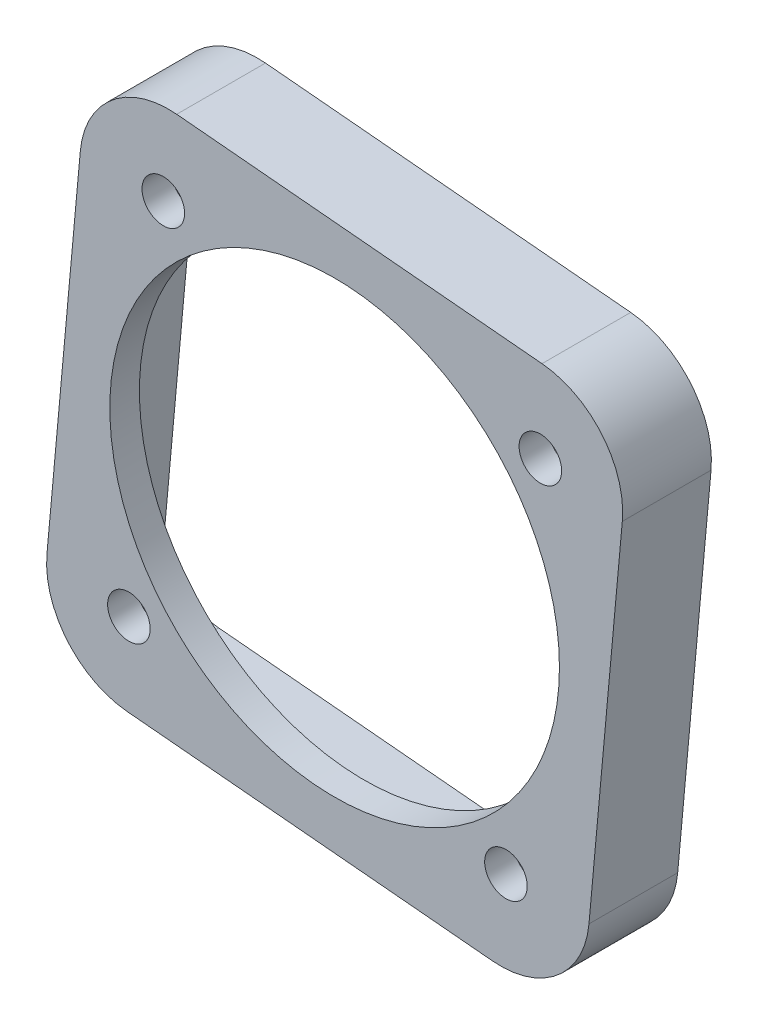
ISO-10303-21;
HEADER;
FILE_DESCRIPTION(('STEP AP214'),'2;1');
FILE_NAME('part.step','',(''),(''),'','','');
FILE_SCHEMA(('AUTOMOTIVE_DESIGN { 1 0 10303 214 1 1 1 1 }'));
ENDSEC;
DATA;
#1=APPLICATION_CONTEXT('core data for automotive mechanical design processes');
#2=APPLICATION_PROTOCOL_DEFINITION('international standard','automotive_design',2000,#1);
#3=PRODUCT_CONTEXT('',#1,'mechanical');
#4=PRODUCT('Part','Part','',(#3));
#5=PRODUCT_RELATED_PRODUCT_CATEGORY('part','',(#4));
#6=PRODUCT_DEFINITION_FORMATION('','',#4);
#7=PRODUCT_DEFINITION_CONTEXT('part definition',#1,'design');
#8=PRODUCT_DEFINITION('design','',#6,#7);
#9=PRODUCT_DEFINITION_SHAPE('','',#8);
#10=(LENGTH_UNIT() NAMED_UNIT(*) SI_UNIT(.MILLI.,.METRE.));
#11=(NAMED_UNIT(*) PLANE_ANGLE_UNIT() SI_UNIT($,.RADIAN.));
#12=(NAMED_UNIT(*) SI_UNIT($,.STERADIAN.) SOLID_ANGLE_UNIT());
#13=UNCERTAINTY_MEASURE_WITH_UNIT(LENGTH_MEASURE(1.E-05),#10,'distance_accuracy_value','');
#14=(GEOMETRIC_REPRESENTATION_CONTEXT(3) GLOBAL_UNCERTAINTY_ASSIGNED_CONTEXT((#13)) GLOBAL_UNIT_ASSIGNED_CONTEXT((#10,
#11,#12)) REPRESENTATION_CONTEXT('',''));
#15=CARTESIAN_POINT('',(0.,0.,0.));
#16=DIRECTION('',(0.,0.,1.));
#17=DIRECTION('',(1.,0.,0.));
#18=AXIS2_PLACEMENT_3D('',#15,#16,#17);
#19=CARTESIAN_POINT('',(15.3932943789456,168.674252987968,-2120.16660239526));
#20=DIRECTION('',(0.0908828134945441,0.995861593903147,0.));
#21=DIRECTION('',(-0.995861593903147,0.0908828134945441,0.));
#22=AXIS2_PLACEMENT_3D('',#19,#20,#21);
#23=PLANE('',#22);
#24=DIRECTION('',(0.,0.,-1.));
#25=VECTOR('',#24,1.);
#26=CARTESIAN_POINT('',(166.28386040117,154.903906532357,-2120.16660239526));
#27=LINE('',#26,#25);
#28=CARTESIAN_POINT('',(166.28386040117,154.903906532357,-2120.16660239526));
#29=VERTEX_POINT('',#28);
#30=CARTESIAN_POINT('',(166.28386040117,154.903906532357,-2127.66660239526));
#31=VERTEX_POINT('',#30);
#32=EDGE_CURVE('E275',#29,#31,#27,.T.);
#33=ORIENTED_EDGE('',*,*,#32,.T.);
#34=DIRECTION('',(0.995861593903147,-0.0908828134945441,0.));
#35=VECTOR('',#34,1.);
#36=CARTESIAN_POINT('',(135.412150990172,157.721273750687,-2127.66660239526));
#37=LINE('',#36,#35);
#38=CARTESIAN_POINT('',(135.412150990172,157.721273750687,-2127.66660239526));
#39=VERTEX_POINT('',#38);
#40=EDGE_CURVE('E231',#39,#31,#37,.T.);
#41=ORIENTED_EDGE('',*,*,#40,.F.);
#42=DIRECTION('',(0.,0.,-1.));
#43=VECTOR('',#42,1.);
#44=CARTESIAN_POINT('',(135.412150990172,157.721273750687,-2120.16660239526));
#45=LINE('',#44,#43);
#46=CARTESIAN_POINT('',(135.412150990172,157.721273750687,-2120.16660239526));
#47=VERTEX_POINT('',#46);
#48=EDGE_CURVE('E11',#47,#39,#45,.T.);
#49=ORIENTED_EDGE('',*,*,#48,.F.);
#50=DIRECTION('',(0.995861593903147,-0.0908828134945441,0.));
#51=VECTOR('',#50,1.);
#52=CARTESIAN_POINT('',(15.3932943789456,168.674252987968,-2120.16660239526));
#53=LINE('',#52,#51);
#54=EDGE_CURVE('E256',#47,#29,#53,.T.);
#55=ORIENTED_EDGE('',*,*,#54,.T.);
#56=EDGE_LOOP('',(#33,#41,#49,#55));
#57=FACE_BOUND('',#56,.T.);
#58=ADVANCED_FACE('F43',(#57),#23,.T.);
#59=CARTESIAN_POINT('',(134.730529888963,150.252311796414,-2120.16660239526));
#60=DIRECTION('',(0.,0.,-1.));
#61=DIRECTION('',(-1.,0.,0.));
#62=AXIS2_PLACEMENT_3D('',#59,#60,#61);
#63=CYLINDRICAL_SURFACE('',#62,7.49999999999999);
#64=ORIENTED_EDGE('',*,*,#48,.T.);
#65=CARTESIAN_POINT('',(134.730529888963,150.252311796414,-2127.66660239526));
#66=DIRECTION('',(0.,0.,-1.));
#67=DIRECTION('',(-1.,0.,0.));
#68=AXIS2_PLACEMENT_3D('',#65,#66,#67);
#69=CIRCLE('',#68,7.49999999999996);
#70=CARTESIAN_POINT('',(127.26156793469,150.933932897623,-2127.66660239526));
#71=VERTEX_POINT('',#70);
#72=EDGE_CURVE('E174',#71,#39,#69,.T.);
#73=ORIENTED_EDGE('',*,*,#72,.F.);
#74=DIRECTION('',(0.,0.,-1.));
#75=VECTOR('',#74,1.);
#76=CARTESIAN_POINT('',(127.26156793469,150.933932897623,-2120.16660239526));
#77=LINE('',#76,#75);
#78=CARTESIAN_POINT('',(127.26156793469,150.933932897623,-2120.16660239526));
#79=VERTEX_POINT('',#78);
#80=EDGE_CURVE('E51',#79,#71,#77,.T.);
#81=ORIENTED_EDGE('',*,*,#80,.F.);
#82=CARTESIAN_POINT('',(134.730529888963,150.252311796414,-2120.16660239526));
#83=DIRECTION('',(0.,0.,1.));
#84=DIRECTION('',(1.,0.,0.));
#85=AXIS2_PLACEMENT_3D('',#82,#83,#84);
#86=CIRCLE('',#85,7.49999999999999);
#87=EDGE_CURVE('E259',#47,#79,#86,.T.);
#88=ORIENTED_EDGE('',*,*,#87,.F.);
#89=EDGE_LOOP('',(#64,#73,#81,#88));
#90=FACE_BOUND('',#89,.T.);
#91=ADVANCED_FACE('F298',(#90),#63,.T.);
#92=CARTESIAN_POINT('',(112.549894656953,-10.2713581360716,-2120.16660239526));
#93=DIRECTION('',(-0.995861593903147,0.0908828134945427,0.));
#94=DIRECTION('',(-0.0908828134945427,-0.995861593903147,0.));
#95=AXIS2_PLACEMENT_3D('',#92,#93,#94);
#96=PLANE('',#95);
#97=ORIENTED_EDGE('',*,*,#80,.T.);
#98=DIRECTION('',(0.0908828134945436,0.995861593903147,0.));
#99=VECTOR('',#98,1.);
#100=CARTESIAN_POINT('',(124.444200716359,120.062223486625,-2127.66660239526));
#101=LINE('',#100,#99);
#102=CARTESIAN_POINT('',(124.444200716359,120.062223486625,-2127.66660239526));
#103=VERTEX_POINT('',#102);
#104=EDGE_CURVE('E249',#103,#71,#101,.T.);
#105=ORIENTED_EDGE('',*,*,#104,.F.);
#106=DIRECTION('',(0.,0.,-1.));
#107=VECTOR('',#106,1.);
#108=CARTESIAN_POINT('',(124.444200716359,120.062223486625,-2120.16660239526));
#109=LINE('',#108,#107);
#110=CARTESIAN_POINT('',(124.444200716359,120.062223486625,-2120.16660239526));
#111=VERTEX_POINT('',#110);
#112=EDGE_CURVE('E287',#111,#103,#109,.T.);
#113=ORIENTED_EDGE('',*,*,#112,.F.);
#114=DIRECTION('',(0.0908828134945427,0.995861593903147,0.));
#115=VECTOR('',#114,1.);
#116=CARTESIAN_POINT('',(112.549894656953,-10.2713581360716,-2120.16660239526));
#117=LINE('',#116,#115);
#118=EDGE_CURVE('E261',#111,#79,#117,.T.);
#119=ORIENTED_EDGE('',*,*,#118,.T.);
#120=EDGE_LOOP('',(#97,#105,#113,#119));
#121=FACE_BOUND('',#120,.T.);
#122=ADVANCED_FACE('F291',(#121),#96,.T.);
#123=CARTESIAN_POINT('',(131.913162670632,119.380602385416,-2120.16660239526));
#124=DIRECTION('',(0.,0.,-1.));
#125=DIRECTION('',(-1.,0.,0.));
#126=AXIS2_PLACEMENT_3D('',#123,#124,#125);
#127=CYLINDRICAL_SURFACE('',#126,7.49999999999999);
#128=ORIENTED_EDGE('',*,*,#112,.T.);
#129=CARTESIAN_POINT('',(131.913162670632,119.380602385416,-2127.66660239526));
#130=DIRECTION('',(0.,0.,-1.));
#131=DIRECTION('',(-1.,0.,0.));
#132=AXIS2_PLACEMENT_3D('',#129,#130,#131);
#133=CIRCLE('',#132,7.49999999999999);
#134=CARTESIAN_POINT('',(131.231541569423,111.911640431143,-2127.66660239526));
#135=VERTEX_POINT('',#134);
#136=EDGE_CURVE('E246',#135,#103,#133,.T.);
#137=ORIENTED_EDGE('',*,*,#136,.F.);
#138=DIRECTION('',(0.,0.,-1.));
#139=VECTOR('',#138,1.);
#140=CARTESIAN_POINT('',(131.231541569423,111.911640431143,-2120.16660239526));
#141=LINE('',#140,#139);
#142=CARTESIAN_POINT('',(131.231541569423,111.911640431143,-2120.16660239526));
#143=VERTEX_POINT('',#142);
#144=EDGE_CURVE('E285',#143,#135,#141,.T.);
#145=ORIENTED_EDGE('',*,*,#144,.F.);
#146=CARTESIAN_POINT('',(131.913162670632,119.380602385416,-2120.16660239526));
#147=DIRECTION('',(0.,0.,1.));
#148=DIRECTION('',(1.,0.,0.));
#149=AXIS2_PLACEMENT_3D('',#146,#147,#148);
#150=CIRCLE('',#149,7.49999999999999);
#151=EDGE_CURVE('E264',#111,#143,#150,.T.);
#152=ORIENTED_EDGE('',*,*,#151,.F.);
#153=EDGE_LOOP('',(#128,#137,#145,#152));
#154=FACE_BOUND('',#153,.T.);
#155=ADVANCED_FACE('F318',(#154),#127,.T.);
#156=CARTESIAN_POINT('',(11.2126849581964,122.864619668424,-2120.16660239526));
#157=DIRECTION('',(-0.0908828134945432,-0.995861593903147,0.));
#158=DIRECTION('',(0.995861593903147,-0.0908828134945432,0.));
#159=AXIS2_PLACEMENT_3D('',#156,#157,#158);
#160=PLANE('',#159);
#161=ORIENTED_EDGE('',*,*,#144,.T.);
#162=DIRECTION('',(-0.995861593903147,0.0908828134945428,0.));
#163=VECTOR('',#162,1.);
#164=CARTESIAN_POINT('',(162.103250980421,109.094273212812,-2127.66660239526));
#165=LINE('',#164,#163);
#166=CARTESIAN_POINT('',(162.103250980421,109.094273212812,-2127.66660239526));
#167=VERTEX_POINT('',#166);
#168=EDGE_CURVE('E243',#167,#135,#165,.T.);
#169=ORIENTED_EDGE('',*,*,#168,.F.);
#170=DIRECTION('',(0.,0.,-1.));
#171=VECTOR('',#170,1.);
#172=CARTESIAN_POINT('',(162.103250980421,109.094273212812,-2120.16660239526));
#173=LINE('',#172,#171);
#174=CARTESIAN_POINT('',(162.103250980421,109.094273212812,-2120.16660239526));
#175=VERTEX_POINT('',#174);
#176=EDGE_CURVE('E283',#175,#167,#173,.T.);
#177=ORIENTED_EDGE('',*,*,#176,.F.);
#178=DIRECTION('',(-0.995861593903147,0.0908828134945432,0.));
#179=VECTOR('',#178,1.);
#180=CARTESIAN_POINT('',(11.2126849581964,122.864619668424,-2120.16660239526));
#181=LINE('',#180,#179);
#182=EDGE_CURVE('E266',#175,#143,#181,.T.);
#183=ORIENTED_EDGE('',*,*,#182,.T.);
#184=EDGE_LOOP('',(#161,#169,#177,#183));
#185=FACE_BOUND('',#184,.T.);
#186=ADVANCED_FACE('F315',(#185),#160,.T.);
#187=CARTESIAN_POINT('',(162.78487208163,116.563235167086,-2120.16660239526));
#188=DIRECTION('',(0.,0.,-1.));
#189=DIRECTION('',(-1.,0.,0.));
#190=AXIS2_PLACEMENT_3D('',#187,#188,#189);
#191=CYLINDRICAL_SURFACE('',#190,7.49999999999997);
#192=ORIENTED_EDGE('',*,*,#176,.T.);
#193=CARTESIAN_POINT('',(162.78487208163,116.563235167086,-2127.66660239526));
#194=DIRECTION('',(0.,0.,-1.));
#195=DIRECTION('',(-1.,0.,0.));
#196=AXIS2_PLACEMENT_3D('',#193,#194,#195);
#197=CIRCLE('',#196,7.49999999999996);
#198=CARTESIAN_POINT('',(170.253834035904,115.881614065876,-2127.66660239526));
#199=VERTEX_POINT('',#198);
#200=EDGE_CURVE('E240',#199,#167,#197,.T.);
#201=ORIENTED_EDGE('',*,*,#200,.F.);
#202=DIRECTION('',(0.,0.,-1.));
#203=VECTOR('',#202,1.);
#204=CARTESIAN_POINT('',(170.253834035904,115.881614065876,-2120.16660239526));
#205=LINE('',#204,#203);
#206=CARTESIAN_POINT('',(170.253834035904,115.881614065876,-2120.16660239526));
#207=VERTEX_POINT('',#206);
#208=EDGE_CURVE('E281',#207,#199,#205,.T.);
#209=ORIENTED_EDGE('',*,*,#208,.F.);
#210=CARTESIAN_POINT('',(162.78487208163,116.563235167086,-2120.16660239526));
#211=DIRECTION('',(0.,0.,1.));
#212=DIRECTION('',(1.,0.,0.));
#213=AXIS2_PLACEMENT_3D('',#210,#211,#212);
#214=CIRCLE('',#213,7.49999999999997);
#215=EDGE_CURVE('E269',#175,#207,#214,.T.);
#216=ORIENTED_EDGE('',*,*,#215,.F.);
#217=EDGE_LOOP('',(#192,#201,#209,#216));
#218=FACE_BOUND('',#217,.T.);
#219=ADVANCED_FACE('F311',(#218),#191,.T.);
#220=CARTESIAN_POINT('',(158.359527976497,-14.4519675568216,-2120.16660239526));
#221=DIRECTION('',(0.995861593903146,-0.0908828134945494,0.));
#222=DIRECTION('',(0.0908828134945494,0.995861593903146,0.));
#223=AXIS2_PLACEMENT_3D('',#220,#221,#222);
#224=PLANE('',#223);
#225=ORIENTED_EDGE('',*,*,#208,.T.);
#226=DIRECTION('',(-0.0908828134945431,-0.995861593903147,0.));
#227=VECTOR('',#226,1.);
#228=CARTESIAN_POINT('',(173.071201254234,146.753323476874,-2127.66660239526));
#229=LINE('',#228,#227);
#230=CARTESIAN_POINT('',(173.071201254234,146.753323476874,-2127.66660239526));
#231=VERTEX_POINT('',#230);
#232=EDGE_CURVE('E237',#231,#199,#229,.T.);
#233=ORIENTED_EDGE('',*,*,#232,.F.);
#234=DIRECTION('',(0.,0.,-1.));
#235=VECTOR('',#234,1.);
#236=CARTESIAN_POINT('',(173.071201254234,146.753323476874,-2120.16660239526));
#237=LINE('',#236,#235);
#238=CARTESIAN_POINT('',(173.071201254234,146.753323476874,-2120.16660239526));
#239=VERTEX_POINT('',#238);
#240=EDGE_CURVE('E279',#239,#231,#237,.T.);
#241=ORIENTED_EDGE('',*,*,#240,.F.);
#242=DIRECTION('',(-0.0908828134945494,-0.995861593903146,0.));
#243=VECTOR('',#242,1.);
#244=CARTESIAN_POINT('',(158.359527976497,-14.4519675568216,-2120.16660239526));
#245=LINE('',#244,#243);
#246=EDGE_CURVE('E271',#239,#207,#245,.T.);
#247=ORIENTED_EDGE('',*,*,#246,.T.);
#248=EDGE_LOOP('',(#225,#233,#241,#247));
#249=FACE_BOUND('',#248,.T.);
#250=ADVANCED_FACE('F306',(#249),#224,.T.);
#251=CARTESIAN_POINT('',(148.757700985297,133.40777348175,-2120.16660239526));
#252=DIRECTION('',(0.,0.,-1.));
#253=DIRECTION('',(-1.,0.,0.));
#254=AXIS2_PLACEMENT_3D('',#251,#252,#253);
#255=CYLINDRICAL_SURFACE('',#254,19.);
#256=CARTESIAN_POINT('',(148.757700985297,133.40777348175,-2120.16660239526));
#257=DIRECTION('',(0.,0.,1.));
#258=DIRECTION('',(1.,0.,0.));
#259=AXIS2_PLACEMENT_3D('',#256,#257,#258);
#260=CIRCLE('',#259,19.);
#261=CARTESIAN_POINT('',(167.757700985297,133.40777348175,-2120.16660239526));
#262=VERTEX_POINT('',#261);
#263=EDGE_CURVE('E253',#262,#262,#260,.T.);
#264=ORIENTED_EDGE('',*,*,#263,.T.);
#265=EDGE_LOOP('',(#264));
#266=FACE_BOUND('',#265,.T.);
#267=CARTESIAN_POINT('',(148.757700985297,133.40777348175,-2122.66660239526));
#268=DIRECTION('',(0.,0.,1.));
#269=DIRECTION('',(1.,0.,0.));
#270=AXIS2_PLACEMENT_3D('',#267,#268,#269);
#271=CIRCLE('',#270,19.);
#272=CARTESIAN_POINT('',(167.757700985297,133.40777348175,-2122.66660239526));
#273=VERTEX_POINT('',#272);
#274=EDGE_CURVE('E252',#273,#273,#271,.T.);
#275=ORIENTED_EDGE('',*,*,#274,.F.);
#276=EDGE_LOOP('',(#275));
#277=FACE_BOUND('',#276,.T.);
#278=ADVANCED_FACE('F45',(#266,#277),#255,.F.);
#279=CARTESIAN_POINT('',(165.602239299961,147.434944578083,-2120.16660239526));
#280=DIRECTION('',(0.,0.,-1.));
#281=DIRECTION('',(-1.,0.,0.));
#282=AXIS2_PLACEMENT_3D('',#279,#280,#281);
#283=CYLINDRICAL_SURFACE('',#282,7.49999999999996);
#284=ORIENTED_EDGE('',*,*,#240,.T.);
#285=CARTESIAN_POINT('',(165.602239299961,147.434944578083,-2127.66660239526));
#286=DIRECTION('',(0.,0.,-1.));
#287=DIRECTION('',(-1.,0.,0.));
#288=AXIS2_PLACEMENT_3D('',#285,#286,#287);
#289=CIRCLE('',#288,7.49999999999993);
#290=EDGE_CURVE('E234',#31,#231,#289,.T.);
#291=ORIENTED_EDGE('',*,*,#290,.F.);
#292=ORIENTED_EDGE('',*,*,#32,.F.);
#293=CARTESIAN_POINT('',(165.602239299961,147.434944578083,-2120.16660239526));
#294=DIRECTION('',(0.,0.,1.));
#295=DIRECTION('',(1.,0.,0.));
#296=AXIS2_PLACEMENT_3D('',#293,#294,#295);
#297=CIRCLE('',#296,7.49999999999996);
#298=EDGE_CURVE('E66',#239,#29,#297,.T.);
#299=ORIENTED_EDGE('',*,*,#298,.F.);
#300=EDGE_LOOP('',(#284,#291,#292,#299));
#301=FACE_BOUND('',#300,.T.);
#302=ADVANCED_FACE('F304',(#301),#283,.T.);
#303=CARTESIAN_POINT('',(0.,0.,-2120.16660239526));
#304=DIRECTION('',(0.,0.,1.));
#305=DIRECTION('',(1.,0.,0.));
#306=AXIS2_PLACEMENT_3D('',#303,#304,#305);
#307=PLANE('',#306);
#308=CARTESIAN_POINT('',(134.278040498759,150.795684000113,-2120.16660239526));
#309=DIRECTION('',(0.,0.,1.));
#310=DIRECTION('',(1.,0.,0.));
#311=AXIS2_PLACEMENT_3D('',#308,#309,#310);
#312=CIRCLE('',#311,1.8);
#313=CARTESIAN_POINT('',(136.078040498759,150.795684000113,-2120.16660239526));
#314=VERTEX_POINT('',#313);
#315=EDGE_CURVE('E616',#314,#314,#312,.T.);
#316=ORIENTED_EDGE('',*,*,#315,.F.);
#317=EDGE_LOOP('',(#316));
#318=FACE_BOUND('',#317,.T.);
#319=CARTESIAN_POINT('',(131.369790466934,118.928112995212,-2120.16660239526));
#320=DIRECTION('',(0.,0.,1.));
#321=DIRECTION('',(1.,0.,0.));
#322=AXIS2_PLACEMENT_3D('',#319,#320,#321);
#323=CIRCLE('',#322,1.8);
#324=CARTESIAN_POINT('',(133.169790466934,118.928112995212,-2120.16660239526));
#325=VERTEX_POINT('',#324);
#326=EDGE_CURVE('E618',#325,#325,#323,.T.);
#327=ORIENTED_EDGE('',*,*,#326,.F.);
#328=EDGE_LOOP('',(#327));
#329=FACE_BOUND('',#328,.T.);
#330=CARTESIAN_POINT('',(163.237361471834,116.019862963387,-2120.16660239526));
#331=DIRECTION('',(0.,0.,1.));
#332=DIRECTION('',(1.,0.,0.));
#333=AXIS2_PLACEMENT_3D('',#330,#331,#332);
#334=CIRCLE('',#333,1.8);
#335=CARTESIAN_POINT('',(165.037361471834,116.019862963387,-2120.16660239526));
#336=VERTEX_POINT('',#335);
#337=EDGE_CURVE('E626',#336,#336,#334,.T.);
#338=ORIENTED_EDGE('',*,*,#337,.F.);
#339=EDGE_LOOP('',(#338));
#340=FACE_BOUND('',#339,.T.);
#341=CARTESIAN_POINT('',(166.14561150366,147.887433968287,-2120.16660239526));
#342=DIRECTION('',(0.,0.,1.));
#343=DIRECTION('',(1.,0.,0.));
#344=AXIS2_PLACEMENT_3D('',#341,#342,#343);
#345=CIRCLE('',#344,1.8);
#346=CARTESIAN_POINT('',(167.94561150366,147.887433968287,-2120.16660239526));
#347=VERTEX_POINT('',#346);
#348=EDGE_CURVE('E632',#347,#347,#345,.T.);
#349=ORIENTED_EDGE('',*,*,#348,.F.);
#350=EDGE_LOOP('',(#349));
#351=FACE_BOUND('',#350,.T.);
#352=ORIENTED_EDGE('',*,*,#263,.F.);
#353=EDGE_LOOP('',(#352));
#354=FACE_BOUND('',#353,.T.);
#355=ORIENTED_EDGE('',*,*,#54,.F.);
#356=ORIENTED_EDGE('',*,*,#87,.T.);
#357=ORIENTED_EDGE('',*,*,#118,.F.);
#358=ORIENTED_EDGE('',*,*,#151,.T.);
#359=ORIENTED_EDGE('',*,*,#182,.F.);
#360=ORIENTED_EDGE('',*,*,#215,.T.);
#361=ORIENTED_EDGE('',*,*,#246,.F.);
#362=ORIENTED_EDGE('',*,*,#298,.T.);
#363=EDGE_LOOP('',(#355,#356,#357,#358,#359,#360,#361,#362));
#364=FACE_BOUND('',#363,.T.);
#365=ADVANCED_FACE('F320',(#318,#329,#340,#351,#354,#364),#307,.T.);
#366=CARTESIAN_POINT('',(0.,0.,-2122.66660239526));
#367=DIRECTION('',(0.,0.,1.));
#368=DIRECTION('',(1.,0.,0.));
#369=AXIS2_PLACEMENT_3D('',#366,#367,#368);
#370=PLANE('',#369);
#371=CARTESIAN_POINT('',(134.278040498759,150.795684000113,-2122.66660239526));
#372=DIRECTION('',(0.,0.,1.));
#373=DIRECTION('',(1.,0.,0.));
#374=AXIS2_PLACEMENT_3D('',#371,#372,#373);
#375=CIRCLE('',#374,1.8);
#376=CARTESIAN_POINT('',(136.078040498759,150.795684000113,-2122.66660239526));
#377=VERTEX_POINT('',#376);
#378=EDGE_CURVE('E614',#377,#377,#375,.T.);
#379=ORIENTED_EDGE('',*,*,#378,.T.);
#380=EDGE_LOOP('',(#379));
#381=FACE_BOUND('',#380,.T.);
#382=CARTESIAN_POINT('',(131.369790466934,118.928112995212,-2122.66660239526));
#383=DIRECTION('',(0.,0.,1.));
#384=DIRECTION('',(1.,0.,0.));
#385=AXIS2_PLACEMENT_3D('',#382,#383,#384);
#386=CIRCLE('',#385,1.8);
#387=CARTESIAN_POINT('',(133.169790466934,118.928112995212,-2122.66660239526));
#388=VERTEX_POINT('',#387);
#389=EDGE_CURVE('E623',#388,#388,#386,.T.);
#390=ORIENTED_EDGE('',*,*,#389,.T.);
#391=EDGE_LOOP('',(#390));
#392=FACE_BOUND('',#391,.T.);
#393=CARTESIAN_POINT('',(163.237361471834,116.019862963387,-2122.66660239526));
#394=DIRECTION('',(0.,0.,1.));
#395=DIRECTION('',(1.,0.,0.));
#396=AXIS2_PLACEMENT_3D('',#393,#394,#395);
#397=CIRCLE('',#396,1.8);
#398=CARTESIAN_POINT('',(165.037361471834,116.019862963387,-2122.66660239526));
#399=VERTEX_POINT('',#398);
#400=EDGE_CURVE('E629',#399,#399,#397,.T.);
#401=ORIENTED_EDGE('',*,*,#400,.T.);
#402=EDGE_LOOP('',(#401));
#403=FACE_BOUND('',#402,.T.);
#404=CARTESIAN_POINT('',(166.14561150366,147.887433968287,-2122.66660239526));
#405=DIRECTION('',(0.,0.,1.));
#406=DIRECTION('',(1.,0.,0.));
#407=AXIS2_PLACEMENT_3D('',#404,#405,#406);
#408=CIRCLE('',#407,1.8);
#409=CARTESIAN_POINT('',(167.94561150366,147.887433968287,-2122.66660239526));
#410=VERTEX_POINT('',#409);
#411=EDGE_CURVE('E198',#410,#410,#408,.T.);
#412=ORIENTED_EDGE('',*,*,#411,.T.);
#413=EDGE_LOOP('',(#412));
#414=FACE_BOUND('',#413,.T.);
#415=DIRECTION('',(0.0908828134945431,0.995861593903147,0.));
#416=VECTOR('',#415,1.);
#417=CARTESIAN_POINT('',(126.933854701117,119.835016452889,-2122.66660239526));
#418=LINE('',#417,#416);
#419=CARTESIAN_POINT('',(126.933854701117,119.835016452889,-2122.66660239526));
#420=VERTEX_POINT('',#419);
#421=CARTESIAN_POINT('',(129.751221919448,150.706725863887,-2122.66660239526));
#422=VERTEX_POINT('',#421);
#423=EDGE_CURVE('E167',#420,#422,#418,.T.);
#424=ORIENTED_EDGE('',*,*,#423,.T.);
#425=CARTESIAN_POINT('',(134.730529888963,150.252311796414,-2122.66660239526));
#426=DIRECTION('',(0.,0.,-1.));
#427=DIRECTION('',(-1.,0.,0.));
#428=AXIS2_PLACEMENT_3D('',#425,#426,#427);
#429=CIRCLE('',#428,4.99999999999999);
#430=CARTESIAN_POINT('',(135.184943956436,155.23161976593,-2122.66660239526));
#431=VERTEX_POINT('',#430);
#432=EDGE_CURVE('E196',#422,#431,#429,.T.);
#433=ORIENTED_EDGE('',*,*,#432,.T.);
#434=DIRECTION('',(0.995861593903147,-0.0908828134945441,0.));
#435=VECTOR('',#434,1.);
#436=CARTESIAN_POINT('',(135.184943956436,155.23161976593,-2122.66660239526));
#437=LINE('',#436,#435);
#438=CARTESIAN_POINT('',(166.056653367434,152.414252547599,-2122.66660239526));
#439=VERTEX_POINT('',#438);
#440=EDGE_CURVE('E173',#431,#439,#437,.T.);
#441=ORIENTED_EDGE('',*,*,#440,.T.);
#442=CARTESIAN_POINT('',(165.602239299961,147.434944578083,-2122.66660239526));
#443=DIRECTION('',(0.,0.,-1.));
#444=DIRECTION('',(-1.,0.,0.));
#445=AXIS2_PLACEMENT_3D('',#442,#443,#444);
#446=CIRCLE('',#445,4.99999999999996);
#447=CARTESIAN_POINT('',(170.581547269477,146.98053051061,-2122.66660239526));
#448=VERTEX_POINT('',#447);
#449=EDGE_CURVE('E200',#439,#448,#446,.T.);
#450=ORIENTED_EDGE('',*,*,#449,.T.);
#451=DIRECTION('',(-0.0908828134945449,-0.995861593903147,0.));
#452=VECTOR('',#451,1.);
#453=CARTESIAN_POINT('',(170.581547269477,146.98053051061,-2122.66660239526));
#454=LINE('',#453,#452);
#455=CARTESIAN_POINT('',(167.764180051146,116.108821099613,-2122.66660239526));
#456=VERTEX_POINT('',#455);
#457=EDGE_CURVE('E203',#448,#456,#454,.T.);
#458=ORIENTED_EDGE('',*,*,#457,.T.);
#459=CARTESIAN_POINT('',(162.78487208163,116.563235167086,-2122.66660239526));
#460=DIRECTION('',(0.,0.,-1.));
#461=DIRECTION('',(-1.,0.,0.));
#462=AXIS2_PLACEMENT_3D('',#459,#460,#461);
#463=CIRCLE('',#462,4.99999999999995);
#464=CARTESIAN_POINT('',(162.330458014157,111.58392719757,-2122.66660239526));
#465=VERTEX_POINT('',#464);
#466=EDGE_CURVE('E206',#456,#465,#463,.T.);
#467=ORIENTED_EDGE('',*,*,#466,.T.);
#468=DIRECTION('',(-0.995861593903147,0.0908828134945432,0.));
#469=VECTOR('',#468,1.);
#470=CARTESIAN_POINT('',(162.330458014157,111.58392719757,-2122.66660239526));
#471=LINE('',#470,#469);
#472=CARTESIAN_POINT('',(131.45874860316,114.401294415901,-2122.66660239526));
#473=VERTEX_POINT('',#472);
#474=EDGE_CURVE('E209',#465,#473,#471,.T.);
#475=ORIENTED_EDGE('',*,*,#474,.T.);
#476=CARTESIAN_POINT('',(131.913162670632,119.380602385416,-2122.66660239526));
#477=DIRECTION('',(0.,0.,-1.));
#478=DIRECTION('',(-1.,0.,0.));
#479=AXIS2_PLACEMENT_3D('',#476,#477,#478);
#480=CIRCLE('',#479,5.);
#481=EDGE_CURVE('E212',#473,#420,#480,.T.);
#482=ORIENTED_EDGE('',*,*,#481,.T.);
#483=EDGE_LOOP('',(#424,#433,#441,#450,#458,#467,#475,#482));
#484=FACE_BOUND('',#483,.T.);
#485=ORIENTED_EDGE('',*,*,#274,.T.);
#486=EDGE_LOOP('',(#485));
#487=FACE_BOUND('',#486,.T.);
#488=ADVANCED_FACE('F322',(#381,#392,#403,#414,#484,#487),#370,.F.);
#489=CARTESIAN_POINT('',(134.730529888963,150.252311796414,-2127.66660239526));
#490=DIRECTION('',(0.,0.,-1.));
#491=DIRECTION('',(-1.,0.,0.));
#492=AXIS2_PLACEMENT_3D('',#489,#490,#491);
#493=PLANE('',#492);
#494=ORIENTED_EDGE('',*,*,#72,.T.);
#495=ORIENTED_EDGE('',*,*,#40,.T.);
#496=ORIENTED_EDGE('',*,*,#290,.T.);
#497=ORIENTED_EDGE('',*,*,#232,.T.);
#498=ORIENTED_EDGE('',*,*,#200,.T.);
#499=ORIENTED_EDGE('',*,*,#168,.T.);
#500=ORIENTED_EDGE('',*,*,#136,.T.);
#501=ORIENTED_EDGE('',*,*,#104,.T.);
#502=EDGE_LOOP('',(#494,#495,#496,#497,#498,#499,#500,#501));
#503=FACE_BOUND('',#502,.T.);
#504=DIRECTION('',(0.995861593903147,-0.0908828134945441,0.));
#505=VECTOR('',#504,1.);
#506=CARTESIAN_POINT('',(135.184943956436,155.23161976593,-2127.66660239526));
#507=LINE('',#506,#505);
#508=CARTESIAN_POINT('',(135.184943956436,155.23161976593,-2127.66660239526));
#509=VERTEX_POINT('',#508);
#510=CARTESIAN_POINT('',(166.056653367434,152.414252547599,-2127.66660239526));
#511=VERTEX_POINT('',#510);
#512=EDGE_CURVE('E166',#509,#511,#507,.T.);
#513=ORIENTED_EDGE('',*,*,#512,.F.);
#514=CARTESIAN_POINT('',(134.730529888963,150.252311796414,-2127.66660239526));
#515=DIRECTION('',(0.,0.,-1.));
#516=DIRECTION('',(-1.,0.,0.));
#517=AXIS2_PLACEMENT_3D('',#514,#515,#516);
#518=CIRCLE('',#517,4.99999999999999);
#519=CARTESIAN_POINT('',(129.751221919448,150.706725863887,-2127.66660239526));
#520=VERTEX_POINT('',#519);
#521=EDGE_CURVE('E158',#520,#509,#518,.T.);
#522=ORIENTED_EDGE('',*,*,#521,.F.);
#523=DIRECTION('',(0.0908828134945431,0.995861593903147,0.));
#524=VECTOR('',#523,1.);
#525=CARTESIAN_POINT('',(126.933854701117,119.835016452889,-2127.66660239526));
#526=LINE('',#525,#524);
#527=CARTESIAN_POINT('',(126.933854701117,119.835016452889,-2127.66660239526));
#528=VERTEX_POINT('',#527);
#529=EDGE_CURVE('E194',#528,#520,#526,.T.);
#530=ORIENTED_EDGE('',*,*,#529,.F.);
#531=CARTESIAN_POINT('',(131.913162670632,119.380602385416,-2127.66660239526));
#532=DIRECTION('',(0.,0.,-1.));
#533=DIRECTION('',(-1.,0.,0.));
#534=AXIS2_PLACEMENT_3D('',#531,#532,#533);
#535=CIRCLE('',#534,5.);
#536=CARTESIAN_POINT('',(131.45874860316,114.401294415901,-2127.66660239526));
#537=VERTEX_POINT('',#536);
#538=EDGE_CURVE('E191',#537,#528,#535,.T.);
#539=ORIENTED_EDGE('',*,*,#538,.F.);
#540=DIRECTION('',(-0.995861593903147,0.0908828134945432,0.));
#541=VECTOR('',#540,1.);
#542=CARTESIAN_POINT('',(162.330458014157,111.58392719757,-2127.66660239526));
#543=LINE('',#542,#541);
#544=CARTESIAN_POINT('',(162.330458014157,111.58392719757,-2127.66660239526));
#545=VERTEX_POINT('',#544);
#546=EDGE_CURVE('E189',#545,#537,#543,.T.);
#547=ORIENTED_EDGE('',*,*,#546,.F.);
#548=CARTESIAN_POINT('',(162.78487208163,116.563235167086,-2127.66660239526));
#549=DIRECTION('',(0.,0.,-1.));
#550=DIRECTION('',(-1.,0.,0.));
#551=AXIS2_PLACEMENT_3D('',#548,#549,#550);
#552=CIRCLE('',#551,4.99999999999995);
#553=CARTESIAN_POINT('',(167.764180051146,116.108821099613,-2127.66660239526));
#554=VERTEX_POINT('',#553);
#555=EDGE_CURVE('E187',#554,#545,#552,.T.);
#556=ORIENTED_EDGE('',*,*,#555,.F.);
#557=DIRECTION('',(-0.0908828134945449,-0.995861593903147,0.));
#558=VECTOR('',#557,1.);
#559=CARTESIAN_POINT('',(170.581547269477,146.98053051061,-2127.66660239526));
#560=LINE('',#559,#558);
#561=CARTESIAN_POINT('',(170.581547269477,146.98053051061,-2127.66660239526));
#562=VERTEX_POINT('',#561);
#563=EDGE_CURVE('E182',#562,#554,#560,.T.);
#564=ORIENTED_EDGE('',*,*,#563,.F.);
#565=CARTESIAN_POINT('',(165.602239299961,147.434944578083,-2127.66660239526));
#566=DIRECTION('',(0.,0.,-1.));
#567=DIRECTION('',(-1.,0.,0.));
#568=AXIS2_PLACEMENT_3D('',#565,#566,#567);
#569=CIRCLE('',#568,4.99999999999996);
#570=EDGE_CURVE('E180',#511,#562,#569,.T.);
#571=ORIENTED_EDGE('',*,*,#570,.F.);
#572=EDGE_LOOP('',(#513,#522,#530,#539,#547,#556,#564,#571));
#573=FACE_BOUND('',#572,.T.);
#574=ADVANCED_FACE('F178',(#503,#573),#493,.T.);
#575=CARTESIAN_POINT('',(134.730529888963,150.252311796414,-2127.66660239526));
#576=DIRECTION('',(0.,0.,1.));
#577=DIRECTION('',(1.,0.,0.));
#578=AXIS2_PLACEMENT_3D('',#575,#576,#577);
#579=CYLINDRICAL_SURFACE('',#578,4.99999999999999);
#580=ORIENTED_EDGE('',*,*,#432,.F.);
#581=DIRECTION('',(0.,0.,1.));
#582=VECTOR('',#581,1.);
#583=CARTESIAN_POINT('',(129.751221919448,150.706725863887,-2127.66660239526));
#584=LINE('',#583,#582);
#585=EDGE_CURVE('E58',#520,#422,#584,.T.);
#586=ORIENTED_EDGE('',*,*,#585,.F.);
#587=ORIENTED_EDGE('',*,*,#521,.T.);
#588=DIRECTION('',(0.,0.,1.));
#589=VECTOR('',#588,1.);
#590=CARTESIAN_POINT('',(135.184943956436,155.23161976593,-2127.66660239526));
#591=LINE('',#590,#589);
#592=EDGE_CURVE('E161',#509,#431,#591,.T.);
#593=ORIENTED_EDGE('',*,*,#592,.T.);
#594=EDGE_LOOP('',(#580,#586,#587,#593));
#595=FACE_BOUND('',#594,.T.);
#596=ADVANCED_FACE('F160',(#595),#579,.F.);
#597=CARTESIAN_POINT('',(135.184943956436,155.23161976593,-2127.66660239526));
#598=DIRECTION('',(-0.0908828134945441,-0.995861593903147,0.));
#599=DIRECTION('',(0.995861593903147,-0.0908828134945441,0.));
#600=AXIS2_PLACEMENT_3D('',#597,#598,#599);
#601=PLANE('',#600);
#602=ORIENTED_EDGE('',*,*,#440,.F.);
#603=ORIENTED_EDGE('',*,*,#592,.F.);
#604=ORIENTED_EDGE('',*,*,#512,.T.);
#605=DIRECTION('',(0.,0.,1.));
#606=VECTOR('',#605,1.);
#607=CARTESIAN_POINT('',(166.056653367434,152.414252547599,-2127.66660239526));
#608=LINE('',#607,#606);
#609=EDGE_CURVE('E175',#511,#439,#608,.T.);
#610=ORIENTED_EDGE('',*,*,#609,.T.);
#611=EDGE_LOOP('',(#602,#603,#604,#610));
#612=FACE_BOUND('',#611,.T.);
#613=ADVANCED_FACE('F170',(#612),#601,.T.);
#614=CARTESIAN_POINT('',(165.602239299961,147.434944578083,-2127.66660239526));
#615=DIRECTION('',(0.,0.,1.));
#616=DIRECTION('',(1.,0.,0.));
#617=AXIS2_PLACEMENT_3D('',#614,#615,#616);
#618=CYLINDRICAL_SURFACE('',#617,4.99999999999996);
#619=ORIENTED_EDGE('',*,*,#449,.F.);
#620=ORIENTED_EDGE('',*,*,#609,.F.);
#621=ORIENTED_EDGE('',*,*,#570,.T.);
#622=DIRECTION('',(0.,0.,1.));
#623=VECTOR('',#622,1.);
#624=CARTESIAN_POINT('',(170.581547269477,146.98053051061,-2127.66660239526));
#625=LINE('',#624,#623);
#626=EDGE_CURVE('E226',#562,#448,#625,.T.);
#627=ORIENTED_EDGE('',*,*,#626,.T.);
#628=EDGE_LOOP('',(#619,#620,#621,#627));
#629=FACE_BOUND('',#628,.T.);
#630=ADVANCED_FACE('F558',(#629),#618,.F.);
#631=CARTESIAN_POINT('',(170.581547269477,146.98053051061,-2127.66660239526));
#632=DIRECTION('',(-0.995861593903147,0.0908828134945449,0.));
#633=DIRECTION('',(-0.0908828134945449,-0.995861593903147,0.));
#634=AXIS2_PLACEMENT_3D('',#631,#632,#633);
#635=PLANE('',#634);
#636=ORIENTED_EDGE('',*,*,#457,.F.);
#637=ORIENTED_EDGE('',*,*,#626,.F.);
#638=ORIENTED_EDGE('',*,*,#563,.T.);
#639=DIRECTION('',(0.,0.,1.));
#640=VECTOR('',#639,1.);
#641=CARTESIAN_POINT('',(167.764180051146,116.108821099613,-2127.66660239526));
#642=LINE('',#641,#640);
#643=EDGE_CURVE('E224',#554,#456,#642,.T.);
#644=ORIENTED_EDGE('',*,*,#643,.T.);
#645=EDGE_LOOP('',(#636,#637,#638,#644));
#646=FACE_BOUND('',#645,.T.);
#647=ADVANCED_FACE('F549',(#646),#635,.T.);
#648=CARTESIAN_POINT('',(162.78487208163,116.563235167086,-2127.66660239526));
#649=DIRECTION('',(0.,0.,1.));
#650=DIRECTION('',(1.,0.,0.));
#651=AXIS2_PLACEMENT_3D('',#648,#649,#650);
#652=CYLINDRICAL_SURFACE('',#651,4.99999999999995);
#653=ORIENTED_EDGE('',*,*,#466,.F.);
#654=ORIENTED_EDGE('',*,*,#643,.F.);
#655=ORIENTED_EDGE('',*,*,#555,.T.);
#656=DIRECTION('',(0.,0.,1.));
#657=VECTOR('',#656,1.);
#658=CARTESIAN_POINT('',(162.330458014157,111.58392719757,-2127.66660239526));
#659=LINE('',#658,#657);
#660=EDGE_CURVE('E222',#545,#465,#659,.T.);
#661=ORIENTED_EDGE('',*,*,#660,.T.);
#662=EDGE_LOOP('',(#653,#654,#655,#661));
#663=FACE_BOUND('',#662,.T.);
#664=ADVANCED_FACE('F540',(#663),#652,.F.);
#665=CARTESIAN_POINT('',(162.330458014157,111.58392719757,-2127.66660239526));
#666=DIRECTION('',(0.0908828134945432,0.995861593903147,0.));
#667=DIRECTION('',(-0.995861593903147,0.0908828134945432,0.));
#668=AXIS2_PLACEMENT_3D('',#665,#666,#667);
#669=PLANE('',#668);
#670=ORIENTED_EDGE('',*,*,#474,.F.);
#671=ORIENTED_EDGE('',*,*,#660,.F.);
#672=ORIENTED_EDGE('',*,*,#546,.T.);
#673=DIRECTION('',(0.,0.,1.));
#674=VECTOR('',#673,1.);
#675=CARTESIAN_POINT('',(131.45874860316,114.401294415901,-2127.66660239526));
#676=LINE('',#675,#674);
#677=EDGE_CURVE('E220',#537,#473,#676,.T.);
#678=ORIENTED_EDGE('',*,*,#677,.T.);
#679=EDGE_LOOP('',(#670,#671,#672,#678));
#680=FACE_BOUND('',#679,.T.);
#681=ADVANCED_FACE('F531',(#680),#669,.T.);
#682=CARTESIAN_POINT('',(131.913162670632,119.380602385416,-2127.66660239526));
#683=DIRECTION('',(0.,0.,1.));
#684=DIRECTION('',(1.,0.,0.));
#685=AXIS2_PLACEMENT_3D('',#682,#683,#684);
#686=CYLINDRICAL_SURFACE('',#685,5.);
#687=ORIENTED_EDGE('',*,*,#481,.F.);
#688=ORIENTED_EDGE('',*,*,#677,.F.);
#689=ORIENTED_EDGE('',*,*,#538,.T.);
#690=DIRECTION('',(0.,0.,1.));
#691=VECTOR('',#690,1.);
#692=CARTESIAN_POINT('',(126.933854701117,119.835016452889,-2127.66660239526));
#693=LINE('',#692,#691);
#694=EDGE_CURVE('E218',#528,#420,#693,.T.);
#695=ORIENTED_EDGE('',*,*,#694,.T.);
#696=EDGE_LOOP('',(#687,#688,#689,#695));
#697=FACE_BOUND('',#696,.T.);
#698=ADVANCED_FACE('F523',(#697),#686,.F.);
#699=CARTESIAN_POINT('',(126.933854701117,119.835016452889,-2127.66660239526));
#700=DIRECTION('',(0.995861593903147,-0.0908828134945432,0.));
#701=DIRECTION('',(0.0908828134945432,0.995861593903147,0.));
#702=AXIS2_PLACEMENT_3D('',#699,#700,#701);
#703=PLANE('',#702);
#704=ORIENTED_EDGE('',*,*,#423,.F.);
#705=ORIENTED_EDGE('',*,*,#694,.F.);
#706=ORIENTED_EDGE('',*,*,#529,.T.);
#707=ORIENTED_EDGE('',*,*,#585,.T.);
#708=EDGE_LOOP('',(#704,#705,#706,#707));
#709=FACE_BOUND('',#708,.T.);
#710=ADVANCED_FACE('F484',(#709),#703,.T.);
#711=CARTESIAN_POINT('',(166.14561150366,147.887433968287,-2120.16660239526));
#712=DIRECTION('',(0.,0.,1.));
#713=DIRECTION('',(1.,0.,0.));
#714=AXIS2_PLACEMENT_3D('',#711,#712,#713);
#715=CYLINDRICAL_SURFACE('',#714,1.8);
#716=ORIENTED_EDGE('',*,*,#411,.F.);
#717=EDGE_LOOP('',(#716));
#718=FACE_BOUND('',#717,.T.);
#719=ORIENTED_EDGE('',*,*,#348,.T.);
#720=EDGE_LOOP('',(#719));
#721=FACE_BOUND('',#720,.T.);
#722=ADVANCED_FACE('F479',(#718,#721),#715,.F.);
#723=CARTESIAN_POINT('',(163.237361471834,116.019862963387,-2120.16660239526));
#724=DIRECTION('',(0.,0.,1.));
#725=DIRECTION('',(1.,0.,0.));
#726=AXIS2_PLACEMENT_3D('',#723,#724,#725);
#727=CYLINDRICAL_SURFACE('',#726,1.8);
#728=ORIENTED_EDGE('',*,*,#400,.F.);
#729=EDGE_LOOP('',(#728));
#730=FACE_BOUND('',#729,.T.);
#731=ORIENTED_EDGE('',*,*,#337,.T.);
#732=EDGE_LOOP('',(#731));
#733=FACE_BOUND('',#732,.T.);
#734=ADVANCED_FACE('F483',(#730,#733),#727,.F.);
#735=CARTESIAN_POINT('',(131.369790466934,118.928112995212,-2120.16660239526));
#736=DIRECTION('',(0.,0.,1.));
#737=DIRECTION('',(1.,0.,0.));
#738=AXIS2_PLACEMENT_3D('',#735,#736,#737);
#739=CYLINDRICAL_SURFACE('',#738,1.8);
#740=ORIENTED_EDGE('',*,*,#389,.F.);
#741=EDGE_LOOP('',(#740));
#742=FACE_BOUND('',#741,.T.);
#743=ORIENTED_EDGE('',*,*,#326,.T.);
#744=EDGE_LOOP('',(#743));
#745=FACE_BOUND('',#744,.T.);
#746=ADVANCED_FACE('F494',(#742,#745),#739,.F.);
#747=CARTESIAN_POINT('',(134.278040498759,150.795684000113,-2120.16660239526));
#748=DIRECTION('',(0.,0.,1.));
#749=DIRECTION('',(1.,0.,0.));
#750=AXIS2_PLACEMENT_3D('',#747,#748,#749);
#751=CYLINDRICAL_SURFACE('',#750,1.8);
#752=ORIENTED_EDGE('',*,*,#378,.F.);
#753=EDGE_LOOP('',(#752));
#754=FACE_BOUND('',#753,.T.);
#755=ORIENTED_EDGE('',*,*,#315,.T.);
#756=EDGE_LOOP('',(#755));
#757=FACE_BOUND('',#756,.T.);
#758=ADVANCED_FACE('F503',(#754,#757),#751,.F.);
#759=CLOSED_SHELL('',(#58,#91,#122,#155,#186,#219,#250,#278,#302,#365,#488,#574,#596,#613,#630,
#647,#664,#681,#698,#710,#722,#734,#746,#758));
#760=MANIFOLD_SOLID_BREP('B2',#759);
#761=ADVANCED_BREP_SHAPE_REPRESENTATION('',(#18,#760),#14);
#762=SHAPE_DEFINITION_REPRESENTATION(#9,#761);
ENDSEC;
END-ISO-10303-21;
